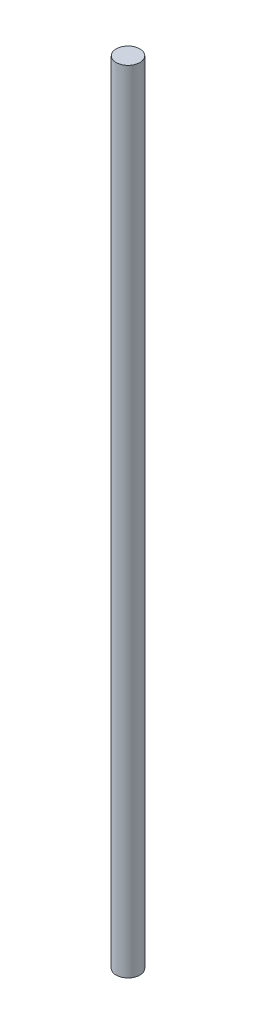
ISO-10303-21;
HEADER;
FILE_DESCRIPTION(('STEP AP214'),'2;1');
FILE_NAME('part.step','',(''),(''),'','','');
FILE_SCHEMA(('AUTOMOTIVE_DESIGN { 1 0 10303 214 1 1 1 1 }'));
ENDSEC;
DATA;
#1=APPLICATION_CONTEXT('core data for automotive mechanical design processes');
#2=APPLICATION_PROTOCOL_DEFINITION('international standard','automotive_design',2000,#1);
#3=PRODUCT_CONTEXT('',#1,'mechanical');
#4=PRODUCT('Part','Part','',(#3));
#5=PRODUCT_RELATED_PRODUCT_CATEGORY('part','',(#4));
#6=PRODUCT_DEFINITION_FORMATION('','',#4);
#7=PRODUCT_DEFINITION_CONTEXT('part definition',#1,'design');
#8=PRODUCT_DEFINITION('design','',#6,#7);
#9=PRODUCT_DEFINITION_SHAPE('','',#8);
#10=(LENGTH_UNIT() NAMED_UNIT(*) SI_UNIT(.MILLI.,.METRE.));
#11=(NAMED_UNIT(*) PLANE_ANGLE_UNIT() SI_UNIT($,.RADIAN.));
#12=(NAMED_UNIT(*) SI_UNIT($,.STERADIAN.) SOLID_ANGLE_UNIT());
#13=UNCERTAINTY_MEASURE_WITH_UNIT(LENGTH_MEASURE(1.E-05),#10,'distance_accuracy_value','');
#14=(GEOMETRIC_REPRESENTATION_CONTEXT(3) GLOBAL_UNCERTAINTY_ASSIGNED_CONTEXT((#13)) GLOBAL_UNIT_ASSIGNED_CONTEXT((#10,
#11,#12)) REPRESENTATION_CONTEXT('',''));
#15=CARTESIAN_POINT('',(0.,0.,0.));
#16=DIRECTION('',(0.,0.,1.));
#17=DIRECTION('',(1.,0.,0.));
#18=AXIS2_PLACEMENT_3D('',#15,#16,#17);
#19=CARTESIAN_POINT('',(0.,400.,0.));
#20=DIRECTION('',(0.,-1.,0.));
#21=DIRECTION('',(0.,0.,-1.));
#22=AXIS2_PLACEMENT_3D('',#19,#20,#21);
#23=CYLINDRICAL_SURFACE('',#22,6.);
#24=CARTESIAN_POINT('',(0.,400.,0.));
#25=DIRECTION('',(0.,1.,0.));
#26=DIRECTION('',(0.,0.,1.));
#27=AXIS2_PLACEMENT_3D('',#24,#25,#26);
#28=CIRCLE('',#27,6.);
#29=CARTESIAN_POINT('',(0.,400.,6.));
#30=VERTEX_POINT('',#29);
#31=EDGE_CURVE('E10',#30,#30,#28,.T.);
#32=ORIENTED_EDGE('',*,*,#31,.F.);
#33=EDGE_LOOP('',(#32));
#34=FACE_BOUND('',#33,.T.);
#35=CARTESIAN_POINT('',(0.,0.,0.));
#36=DIRECTION('',(0.,1.,0.));
#37=DIRECTION('',(0.,0.,1.));
#38=AXIS2_PLACEMENT_3D('',#35,#36,#37);
#39=CIRCLE('',#38,6.);
#40=CARTESIAN_POINT('',(0.,0.,6.));
#41=VERTEX_POINT('',#40);
#42=EDGE_CURVE('E35',#41,#41,#39,.T.);
#43=ORIENTED_EDGE('',*,*,#42,.T.);
#44=EDGE_LOOP('',(#43));
#45=FACE_BOUND('',#44,.T.);
#46=ADVANCED_FACE('F32',(#34,#45),#23,.T.);
#47=CARTESIAN_POINT('',(0.,400.,0.));
#48=DIRECTION('',(0.,1.,0.));
#49=DIRECTION('',(0.,0.,1.));
#50=AXIS2_PLACEMENT_3D('',#47,#48,#49);
#51=PLANE('',#50);
#52=ORIENTED_EDGE('',*,*,#31,.T.);
#53=EDGE_LOOP('',(#52));
#54=FACE_BOUND('',#53,.T.);
#55=ADVANCED_FACE('F47',(#54),#51,.T.);
#56=CARTESIAN_POINT('',(0.,0.,0.));
#57=DIRECTION('',(0.,1.,0.));
#58=DIRECTION('',(0.,0.,1.));
#59=AXIS2_PLACEMENT_3D('',#56,#57,#58);
#60=PLANE('',#59);
#61=ORIENTED_EDGE('',*,*,#42,.F.);
#62=EDGE_LOOP('',(#61));
#63=FACE_BOUND('',#62,.T.);
#64=ADVANCED_FACE('F45',(#63),#60,.F.);
#65=CLOSED_SHELL('',(#46,#55,#64));
#66=MANIFOLD_SOLID_BREP('B2',#65);
#67=ADVANCED_BREP_SHAPE_REPRESENTATION('',(#18,#66),#14);
#68=SHAPE_DEFINITION_REPRESENTATION(#9,#67);
ENDSEC;
END-ISO-10303-21;
